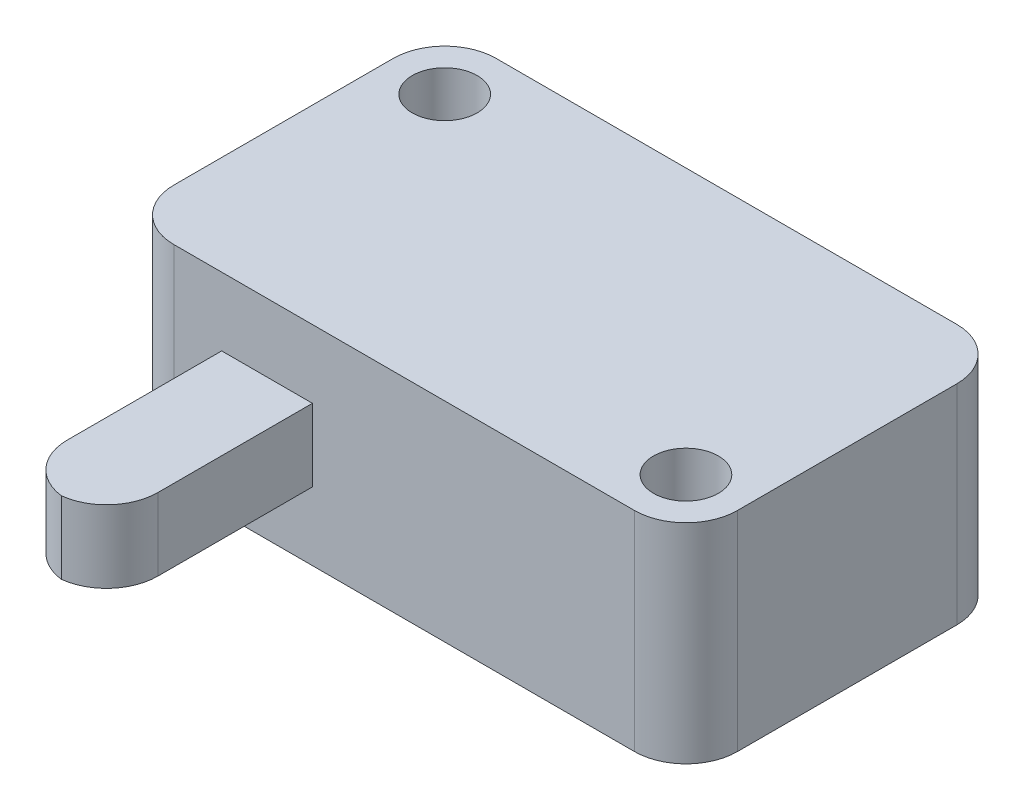
ISO-10303-21;
HEADER;
FILE_DESCRIPTION(('STEP AP214'),'2;1');
FILE_NAME('part.step','',(''),(''),'','','');
FILE_SCHEMA(('AUTOMOTIVE_DESIGN { 1 0 10303 214 1 1 1 1 }'));
ENDSEC;
DATA;
#1=APPLICATION_CONTEXT('core data for automotive mechanical design processes');
#2=APPLICATION_PROTOCOL_DEFINITION('international standard','automotive_design',2000,#1);
#3=PRODUCT_CONTEXT('',#1,'mechanical');
#4=PRODUCT('Part','Part','',(#3));
#5=PRODUCT_RELATED_PRODUCT_CATEGORY('part','',(#4));
#6=PRODUCT_DEFINITION_FORMATION('','',#4);
#7=PRODUCT_DEFINITION_CONTEXT('part definition',#1,'design');
#8=PRODUCT_DEFINITION('design','',#6,#7);
#9=PRODUCT_DEFINITION_SHAPE('','',#8);
#10=(LENGTH_UNIT() NAMED_UNIT(*) SI_UNIT(.MILLI.,.METRE.));
#11=(NAMED_UNIT(*) PLANE_ANGLE_UNIT() SI_UNIT($,.RADIAN.));
#12=(NAMED_UNIT(*) SI_UNIT($,.STERADIAN.) SOLID_ANGLE_UNIT());
#13=UNCERTAINTY_MEASURE_WITH_UNIT(LENGTH_MEASURE(1.E-05),#10,'distance_accuracy_value','');
#14=(GEOMETRIC_REPRESENTATION_CONTEXT(3) GLOBAL_UNCERTAINTY_ASSIGNED_CONTEXT((#13)) GLOBAL_UNIT_ASSIGNED_CONTEXT((#10,
#11,#12)) REPRESENTATION_CONTEXT('',''));
#15=CARTESIAN_POINT('',(0.,0.,0.));
#16=DIRECTION('',(0.,0.,1.));
#17=DIRECTION('',(1.,0.,0.));
#18=AXIS2_PLACEMENT_3D('',#15,#16,#17);
#19=CARTESIAN_POINT('',(-13.9,10.3,7.95));
#20=DIRECTION('',(0.,0.,-1.));
#21=DIRECTION('',(-1.,0.,0.));
#22=AXIS2_PLACEMENT_3D('',#19,#20,#21);
#23=PLANE('',#22);
#24=DIRECTION('',(1.,0.,0.));
#25=VECTOR('',#24,1.);
#26=CARTESIAN_POINT('',(-13.9,10.3,7.95));
#27=LINE('',#26,#25);
#28=CARTESIAN_POINT('',(-11.36,10.3,7.95));
#29=VERTEX_POINT('',#28);
#30=CARTESIAN_POINT('',(11.36,10.3,7.95));
#31=VERTEX_POINT('',#30);
#32=EDGE_CURVE('E181',#29,#31,#27,.T.);
#33=ORIENTED_EDGE('',*,*,#32,.F.);
#34=DIRECTION('',(0.,-1.,0.));
#35=VECTOR('',#34,1.);
#36=CARTESIAN_POINT('',(-11.36,10.3,7.95));
#37=LINE('',#36,#35);
#38=CARTESIAN_POINT('',(-11.36,0.,7.95));
#39=VERTEX_POINT('',#38);
#40=EDGE_CURVE('E196',#29,#39,#37,.T.);
#41=ORIENTED_EDGE('',*,*,#40,.T.);
#42=DIRECTION('',(1.,0.,0.));
#43=VECTOR('',#42,1.);
#44=CARTESIAN_POINT('',(-13.9,0.,7.95));
#45=LINE('',#44,#43);
#46=CARTESIAN_POINT('',(11.36,0.,7.95));
#47=VERTEX_POINT('',#46);
#48=EDGE_CURVE('E175',#39,#47,#45,.T.);
#49=ORIENTED_EDGE('',*,*,#48,.T.);
#50=DIRECTION('',(0.,-1.,0.));
#51=VECTOR('',#50,1.);
#52=CARTESIAN_POINT('',(11.36,10.3,7.95));
#53=LINE('',#52,#51);
#54=EDGE_CURVE('E184',#47,#31,#53,.F.);
#55=ORIENTED_EDGE('',*,*,#54,.T.);
#56=EDGE_LOOP('',(#33,#41,#49,#55));
#57=FACE_BOUND('',#56,.T.);
#58=DIRECTION('',(1.,0.,0.));
#59=VECTOR('',#58,1.);
#60=CARTESIAN_POINT('',(-4.52382319195976,3.3643919059321,7.95));
#61=LINE('',#60,#59);
#62=CARTESIAN_POINT('',(-9.,3.3643919059321,7.95));
#63=VERTEX_POINT('',#62);
#64=CARTESIAN_POINT('',(-4.52382319195976,3.3643919059321,7.95));
#65=VERTEX_POINT('',#64);
#66=EDGE_CURVE('E129',#63,#65,#61,.T.);
#67=ORIENTED_EDGE('',*,*,#66,.F.);
#68=DIRECTION('',(0.,-1.,0.));
#69=VECTOR('',#68,1.);
#70=CARTESIAN_POINT('',(-9.,5.15,7.95));
#71=LINE('',#70,#69);
#72=CARTESIAN_POINT('',(-9.,6.9356080940679,7.95));
#73=VERTEX_POINT('',#72);
#74=EDGE_CURVE('E143',#73,#63,#71,.T.);
#75=ORIENTED_EDGE('',*,*,#74,.F.);
#76=DIRECTION('',(-1.,0.,0.));
#77=VECTOR('',#76,1.);
#78=CARTESIAN_POINT('',(-9.,6.9356080940679,7.95));
#79=LINE('',#78,#77);
#80=CARTESIAN_POINT('',(-4.52382319195976,6.9356080940679,7.95));
#81=VERTEX_POINT('',#80);
#82=EDGE_CURVE('E150',#81,#73,#79,.T.);
#83=ORIENTED_EDGE('',*,*,#82,.F.);
#84=DIRECTION('',(0.,1.,0.));
#85=VECTOR('',#84,1.);
#86=CARTESIAN_POINT('',(-4.52382319195976,6.9356080940679,7.95));
#87=LINE('',#86,#85);
#88=EDGE_CURVE('E146',#65,#81,#87,.T.);
#89=ORIENTED_EDGE('',*,*,#88,.F.);
#90=EDGE_LOOP('',(#67,#75,#83,#89));
#91=FACE_BOUND('',#90,.T.);
#92=ADVANCED_FACE('F33',(#57,#91),#23,.F.);
#93=CARTESIAN_POINT('',(13.9,10.3,7.95));
#94=DIRECTION('',(-1.,0.,0.));
#95=DIRECTION('',(0.,0.,1.));
#96=AXIS2_PLACEMENT_3D('',#93,#94,#95);
#97=PLANE('',#96);
#98=DIRECTION('',(0.,0.,-1.));
#99=VECTOR('',#98,1.);
#100=CARTESIAN_POINT('',(13.9,0.,7.95));
#101=LINE('',#100,#99);
#102=CARTESIAN_POINT('',(13.9,0.,5.41));
#103=VERTEX_POINT('',#102);
#104=CARTESIAN_POINT('',(13.9,0.,-5.41));
#105=VERTEX_POINT('',#104);
#106=EDGE_CURVE('E168',#103,#105,#101,.T.);
#107=ORIENTED_EDGE('',*,*,#106,.T.);
#108=DIRECTION('',(0.,-1.,0.));
#109=VECTOR('',#108,1.);
#110=CARTESIAN_POINT('',(13.9,10.3,-5.41));
#111=LINE('',#110,#109);
#112=CARTESIAN_POINT('',(13.9,10.3,-5.41));
#113=VERTEX_POINT('',#112);
#114=EDGE_CURVE('E228',#105,#113,#111,.F.);
#115=ORIENTED_EDGE('',*,*,#114,.T.);
#116=DIRECTION('',(0.,0.,-1.));
#117=VECTOR('',#116,1.);
#118=CARTESIAN_POINT('',(13.9,10.3,7.95));
#119=LINE('',#118,#117);
#120=CARTESIAN_POINT('',(13.9,10.3,5.41));
#121=VERTEX_POINT('',#120);
#122=EDGE_CURVE('E171',#121,#113,#119,.T.);
#123=ORIENTED_EDGE('',*,*,#122,.F.);
#124=DIRECTION('',(0.,-1.,0.));
#125=VECTOR('',#124,1.);
#126=CARTESIAN_POINT('',(13.9,10.3,5.41));
#127=LINE('',#126,#125);
#128=EDGE_CURVE('E225',#121,#103,#127,.T.);
#129=ORIENTED_EDGE('',*,*,#128,.T.);
#130=EDGE_LOOP('',(#107,#115,#123,#129));
#131=FACE_BOUND('',#130,.T.);
#132=ADVANCED_FACE('F253',(#131),#97,.F.);
#133=CARTESIAN_POINT('',(-13.9,10.3,-7.95));
#134=DIRECTION('',(0.,0.,1.));
#135=DIRECTION('',(1.,0.,0.));
#136=AXIS2_PLACEMENT_3D('',#133,#134,#135);
#137=PLANE('',#136);
#138=DIRECTION('',(-1.,0.,0.));
#139=VECTOR('',#138,1.);
#140=CARTESIAN_POINT('',(-13.9,0.,-7.95));
#141=LINE('',#140,#139);
#142=CARTESIAN_POINT('',(11.36,0.,-7.95));
#143=VERTEX_POINT('',#142);
#144=CARTESIAN_POINT('',(-11.36,0.,-7.95));
#145=VERTEX_POINT('',#144);
#146=EDGE_CURVE('E187',#143,#145,#141,.T.);
#147=ORIENTED_EDGE('',*,*,#146,.T.);
#148=DIRECTION('',(0.,-1.,0.));
#149=VECTOR('',#148,1.);
#150=CARTESIAN_POINT('',(-11.36,10.3,-7.95));
#151=LINE('',#150,#149);
#152=CARTESIAN_POINT('',(-11.36,10.3,-7.95));
#153=VERTEX_POINT('',#152);
#154=EDGE_CURVE('E223',#145,#153,#151,.F.);
#155=ORIENTED_EDGE('',*,*,#154,.T.);
#156=DIRECTION('',(-1.,0.,0.));
#157=VECTOR('',#156,1.);
#158=CARTESIAN_POINT('',(-13.9,10.3,-7.95));
#159=LINE('',#158,#157);
#160=CARTESIAN_POINT('',(11.36,10.3,-7.95));
#161=VERTEX_POINT('',#160);
#162=EDGE_CURVE('E174',#161,#153,#159,.T.);
#163=ORIENTED_EDGE('',*,*,#162,.F.);
#164=DIRECTION('',(0.,-1.,0.));
#165=VECTOR('',#164,1.);
#166=CARTESIAN_POINT('',(11.36,10.3,-7.95));
#167=LINE('',#166,#165);
#168=EDGE_CURVE('E220',#161,#143,#167,.T.);
#169=ORIENTED_EDGE('',*,*,#168,.T.);
#170=EDGE_LOOP('',(#147,#155,#163,#169));
#171=FACE_BOUND('',#170,.T.);
#172=ADVANCED_FACE('F259',(#171),#137,.F.);
#173=CARTESIAN_POINT('',(-13.9,10.3,7.95));
#174=DIRECTION('',(1.,0.,0.));
#175=DIRECTION('',(0.,0.,-1.));
#176=AXIS2_PLACEMENT_3D('',#173,#174,#175);
#177=PLANE('',#176);
#178=DIRECTION('',(0.,0.,1.));
#179=VECTOR('',#178,1.);
#180=CARTESIAN_POINT('',(-13.9,0.,7.95));
#181=LINE('',#180,#179);
#182=CARTESIAN_POINT('',(-13.9,0.,-5.41));
#183=VERTEX_POINT('',#182);
#184=CARTESIAN_POINT('',(-13.9,0.,5.41));
#185=VERTEX_POINT('',#184);
#186=EDGE_CURVE('E190',#183,#185,#181,.T.);
#187=ORIENTED_EDGE('',*,*,#186,.T.);
#188=DIRECTION('',(0.,-1.,0.));
#189=VECTOR('',#188,1.);
#190=CARTESIAN_POINT('',(-13.9,10.3,5.41));
#191=LINE('',#190,#189);
#192=CARTESIAN_POINT('',(-13.9,10.3,5.41));
#193=VERTEX_POINT('',#192);
#194=EDGE_CURVE('E210',#185,#193,#191,.F.);
#195=ORIENTED_EDGE('',*,*,#194,.T.);
#196=DIRECTION('',(0.,0.,1.));
#197=VECTOR('',#196,1.);
#198=CARTESIAN_POINT('',(-13.9,10.3,7.95));
#199=LINE('',#198,#197);
#200=CARTESIAN_POINT('',(-13.9,10.3,-5.41));
#201=VERTEX_POINT('',#200);
#202=EDGE_CURVE('E178',#201,#193,#199,.T.);
#203=ORIENTED_EDGE('',*,*,#202,.F.);
#204=DIRECTION('',(0.,-1.,0.));
#205=VECTOR('',#204,1.);
#206=CARTESIAN_POINT('',(-13.9,10.3,-5.41));
#207=LINE('',#206,#205);
#208=EDGE_CURVE('E207',#201,#183,#207,.T.);
#209=ORIENTED_EDGE('',*,*,#208,.T.);
#210=EDGE_LOOP('',(#187,#195,#203,#209));
#211=FACE_BOUND('',#210,.T.);
#212=ADVANCED_FACE('F267',(#211),#177,.F.);
#213=CARTESIAN_POINT('',(0.,10.3,0.));
#214=DIRECTION('',(0.,-1.,0.));
#215=DIRECTION('',(0.,0.,-1.));
#216=AXIS2_PLACEMENT_3D('',#213,#214,#215);
#217=PLANE('',#216);
#218=CARTESIAN_POINT('',(11.1,10.3,5.15));
#219=DIRECTION('',(0.,1.,0.));
#220=DIRECTION('',(0.,0.,-1.));
#221=AXIS2_PLACEMENT_3D('',#218,#219,#220);
#222=CIRCLE('',#221,1.6);
#223=CARTESIAN_POINT('',(11.1,10.3,6.75));
#224=VERTEX_POINT('',#223);
#225=EDGE_CURVE('E136',#224,#224,#222,.T.);
#226=ORIENTED_EDGE('',*,*,#225,.F.);
#227=EDGE_LOOP('',(#226));
#228=FACE_BOUND('',#227,.T.);
#229=CARTESIAN_POINT('',(-11.1,10.3,-5.15));
#230=DIRECTION('',(0.,1.,0.));
#231=DIRECTION('',(0.,0.,1.));
#232=AXIS2_PLACEMENT_3D('',#229,#230,#231);
#233=CIRCLE('',#232,1.6);
#234=CARTESIAN_POINT('',(-11.1,10.3,-3.55));
#235=VERTEX_POINT('',#234);
#236=EDGE_CURVE('E162',#235,#235,#233,.T.);
#237=ORIENTED_EDGE('',*,*,#236,.F.);
#238=EDGE_LOOP('',(#237));
#239=FACE_BOUND('',#238,.T.);
#240=ORIENTED_EDGE('',*,*,#202,.T.);
#241=CARTESIAN_POINT('',(-11.36,10.3,5.41));
#242=DIRECTION('',(0.,-1.,0.));
#243=DIRECTION('',(0.,0.,-1.));
#244=AXIS2_PLACEMENT_3D('',#241,#242,#243);
#245=CIRCLE('',#244,2.54);
#246=EDGE_CURVE('E218',#193,#29,#245,.F.);
#247=ORIENTED_EDGE('',*,*,#246,.T.);
#248=ORIENTED_EDGE('',*,*,#32,.T.);
#249=CARTESIAN_POINT('',(11.36,10.3,5.41));
#250=DIRECTION('',(0.,-1.,0.));
#251=DIRECTION('',(0.,0.,-1.));
#252=AXIS2_PLACEMENT_3D('',#249,#250,#251);
#253=CIRCLE('',#252,2.54);
#254=EDGE_CURVE('E212',#31,#121,#253,.F.);
#255=ORIENTED_EDGE('',*,*,#254,.T.);
#256=ORIENTED_EDGE('',*,*,#122,.T.);
#257=CARTESIAN_POINT('',(11.36,10.3,-5.41));
#258=DIRECTION('',(0.,-1.,0.));
#259=DIRECTION('',(0.,0.,-1.));
#260=AXIS2_PLACEMENT_3D('',#257,#258,#259);
#261=CIRCLE('',#260,2.54);
#262=EDGE_CURVE('E214',#113,#161,#261,.F.);
#263=ORIENTED_EDGE('',*,*,#262,.T.);
#264=ORIENTED_EDGE('',*,*,#162,.T.);
#265=CARTESIAN_POINT('',(-11.36,10.3,-5.41));
#266=DIRECTION('',(0.,-1.,0.));
#267=DIRECTION('',(0.,0.,-1.));
#268=AXIS2_PLACEMENT_3D('',#265,#266,#267);
#269=CIRCLE('',#268,2.54);
#270=EDGE_CURVE('E216',#153,#201,#269,.F.);
#271=ORIENTED_EDGE('',*,*,#270,.T.);
#272=EDGE_LOOP('',(#240,#247,#248,#255,#256,#263,#264,#271));
#273=FACE_BOUND('',#272,.T.);
#274=ADVANCED_FACE('F270',(#228,#239,#273),#217,.F.);
#275=CARTESIAN_POINT('',(0.,0.,0.));
#276=DIRECTION('',(0.,-1.,0.));
#277=DIRECTION('',(0.,0.,-1.));
#278=AXIS2_PLACEMENT_3D('',#275,#276,#277);
#279=PLANE('',#278);
#280=CARTESIAN_POINT('',(11.1,0.,5.15));
#281=DIRECTION('',(0.,1.,0.));
#282=DIRECTION('',(0.,0.,-1.));
#283=AXIS2_PLACEMENT_3D('',#280,#281,#282);
#284=CIRCLE('',#283,1.6);
#285=CARTESIAN_POINT('',(11.1,0.,6.75));
#286=VERTEX_POINT('',#285);
#287=EDGE_CURVE('E159',#286,#286,#284,.T.);
#288=ORIENTED_EDGE('',*,*,#287,.T.);
#289=EDGE_LOOP('',(#288));
#290=FACE_BOUND('',#289,.T.);
#291=CARTESIAN_POINT('',(-11.1,0.,-5.15));
#292=DIRECTION('',(0.,1.,0.));
#293=DIRECTION('',(0.,0.,1.));
#294=AXIS2_PLACEMENT_3D('',#291,#292,#293);
#295=CIRCLE('',#294,1.6);
#296=CARTESIAN_POINT('',(-11.1,0.,-3.55));
#297=VERTEX_POINT('',#296);
#298=EDGE_CURVE('E165',#297,#297,#295,.T.);
#299=ORIENTED_EDGE('',*,*,#298,.T.);
#300=EDGE_LOOP('',(#299));
#301=FACE_BOUND('',#300,.T.);
#302=ORIENTED_EDGE('',*,*,#48,.F.);
#303=CARTESIAN_POINT('',(-11.36,0.,5.41));
#304=DIRECTION('',(0.,-1.,0.));
#305=DIRECTION('',(0.,0.,-1.));
#306=AXIS2_PLACEMENT_3D('',#303,#304,#305);
#307=CIRCLE('',#306,2.54);
#308=EDGE_CURVE('E205',#39,#185,#307,.T.);
#309=ORIENTED_EDGE('',*,*,#308,.T.);
#310=ORIENTED_EDGE('',*,*,#186,.F.);
#311=CARTESIAN_POINT('',(-11.36,0.,-5.41));
#312=DIRECTION('',(0.,-1.,0.));
#313=DIRECTION('',(0.,0.,-1.));
#314=AXIS2_PLACEMENT_3D('',#311,#312,#313);
#315=CIRCLE('',#314,2.54);
#316=EDGE_CURVE('E203',#183,#145,#315,.T.);
#317=ORIENTED_EDGE('',*,*,#316,.T.);
#318=ORIENTED_EDGE('',*,*,#146,.F.);
#319=CARTESIAN_POINT('',(11.36,0.,-5.41));
#320=DIRECTION('',(0.,-1.,0.));
#321=DIRECTION('',(0.,0.,-1.));
#322=AXIS2_PLACEMENT_3D('',#319,#320,#321);
#323=CIRCLE('',#322,2.54);
#324=EDGE_CURVE('E201',#143,#105,#323,.T.);
#325=ORIENTED_EDGE('',*,*,#324,.T.);
#326=ORIENTED_EDGE('',*,*,#106,.F.);
#327=CARTESIAN_POINT('',(11.36,0.,5.41));
#328=DIRECTION('',(0.,-1.,0.));
#329=DIRECTION('',(0.,0.,-1.));
#330=AXIS2_PLACEMENT_3D('',#327,#328,#329);
#331=CIRCLE('',#330,2.54);
#332=EDGE_CURVE('E199',#103,#47,#331,.T.);
#333=ORIENTED_EDGE('',*,*,#332,.T.);
#334=EDGE_LOOP('',(#302,#309,#310,#317,#318,#325,#326,#333));
#335=FACE_BOUND('',#334,.T.);
#336=ADVANCED_FACE('F265',(#290,#301,#335),#279,.T.);
#337=CARTESIAN_POINT('',(-11.1,0.,-5.15));
#338=DIRECTION('',(0.,1.,0.));
#339=DIRECTION('',(0.,0.,1.));
#340=AXIS2_PLACEMENT_3D('',#337,#338,#339);
#341=CYLINDRICAL_SURFACE('',#340,1.6);
#342=CARTESIAN_POINT('',(-11.1,0.,-3.55));
#343=CARTESIAN_POINT('',(-11.1,0.107291666666667,-3.55));
#344=CARTESIAN_POINT('',(-11.1,0.214583333333333,-3.55));
#345=CARTESIAN_POINT('',(-11.1,0.429166666666667,-3.55));
#346=CARTESIAN_POINT('',(-11.1,0.536458333333333,-3.55));
#347=CARTESIAN_POINT('',(-11.1,0.751041666666667,-3.55));
#348=CARTESIAN_POINT('',(-11.1,0.858333333333333,-3.55));
#349=CARTESIAN_POINT('',(-11.1,1.07291666666667,-3.55));
#350=CARTESIAN_POINT('',(-11.1,1.18020833333333,-3.55));
#351=CARTESIAN_POINT('',(-11.1,1.39479166666667,-3.55));
#352=CARTESIAN_POINT('',(-11.1,1.50208333333333,-3.55));
#353=CARTESIAN_POINT('',(-11.1,1.71666666666667,-3.55));
#354=CARTESIAN_POINT('',(-11.1,1.82395833333333,-3.55));
#355=CARTESIAN_POINT('',(-11.1,2.03854166666667,-3.55));
#356=CARTESIAN_POINT('',(-11.1,2.14583333333333,-3.55));
#357=CARTESIAN_POINT('',(-11.1,2.36041666666667,-3.55));
#358=CARTESIAN_POINT('',(-11.1,2.46770833333333,-3.55));
#359=CARTESIAN_POINT('',(-11.1,2.68229166666667,-3.55));
#360=CARTESIAN_POINT('',(-11.1,2.78958333333333,-3.55));
#361=CARTESIAN_POINT('',(-11.1,3.00416666666667,-3.55));
#362=CARTESIAN_POINT('',(-11.1,3.11145833333333,-3.55));
#363=CARTESIAN_POINT('',(-11.1,3.32604166666667,-3.55));
#364=CARTESIAN_POINT('',(-11.1,3.43333333333333,-3.55));
#365=CARTESIAN_POINT('',(-11.1,3.64791666666667,-3.55));
#366=CARTESIAN_POINT('',(-11.1,3.75520833333333,-3.55));
#367=CARTESIAN_POINT('',(-11.1,3.96979166666667,-3.55));
#368=CARTESIAN_POINT('',(-11.1,4.07708333333333,-3.55));
#369=CARTESIAN_POINT('',(-11.1,4.29166666666667,-3.55));
#370=CARTESIAN_POINT('',(-11.1,4.39895833333333,-3.55));
#371=CARTESIAN_POINT('',(-11.1,4.61354166666667,-3.55));
#372=CARTESIAN_POINT('',(-11.1,4.72083333333333,-3.55));
#373=CARTESIAN_POINT('',(-11.1,4.93541666666667,-3.55));
#374=CARTESIAN_POINT('',(-11.1,5.04270833333333,-3.55));
#375=CARTESIAN_POINT('',(-11.1,5.25729166666667,-3.55));
#376=CARTESIAN_POINT('',(-11.1,5.36458333333333,-3.55));
#377=CARTESIAN_POINT('',(-11.1,5.57916666666667,-3.55));
#378=CARTESIAN_POINT('',(-11.1,5.68645833333333,-3.55));
#379=CARTESIAN_POINT('',(-11.1,5.90104166666667,-3.55));
#380=CARTESIAN_POINT('',(-11.1,6.00833333333333,-3.55));
#381=CARTESIAN_POINT('',(-11.1,6.22291666666667,-3.55));
#382=CARTESIAN_POINT('',(-11.1,6.33020833333333,-3.55));
#383=CARTESIAN_POINT('',(-11.1,6.54479166666667,-3.55));
#384=CARTESIAN_POINT('',(-11.1,6.65208333333333,-3.55));
#385=CARTESIAN_POINT('',(-11.1,6.86666666666667,-3.55));
#386=CARTESIAN_POINT('',(-11.1,6.97395833333333,-3.55));
#387=CARTESIAN_POINT('',(-11.1,7.18854166666667,-3.55));
#388=CARTESIAN_POINT('',(-11.1,7.29583333333333,-3.55));
#389=CARTESIAN_POINT('',(-11.1,7.51041666666667,-3.55));
#390=CARTESIAN_POINT('',(-11.1,7.61770833333333,-3.55));
#391=CARTESIAN_POINT('',(-11.1,7.83229166666667,-3.55));
#392=CARTESIAN_POINT('',(-11.1,7.93958333333333,-3.55));
#393=CARTESIAN_POINT('',(-11.1,8.15416666666667,-3.55));
#394=CARTESIAN_POINT('',(-11.1,8.26145833333333,-3.55));
#395=CARTESIAN_POINT('',(-11.1,8.47604166666667,-3.55));
#396=CARTESIAN_POINT('',(-11.1,8.58333333333333,-3.55));
#397=CARTESIAN_POINT('',(-11.1,8.79791666666667,-3.55));
#398=CARTESIAN_POINT('',(-11.1,8.90520833333333,-3.55));
#399=CARTESIAN_POINT('',(-11.1,9.11979166666666,-3.55));
#400=CARTESIAN_POINT('',(-11.1,9.22708333333333,-3.55));
#401=CARTESIAN_POINT('',(-11.1,9.44166666666667,-3.55));
#402=CARTESIAN_POINT('',(-11.1,9.54895833333333,-3.55));
#403=CARTESIAN_POINT('',(-11.1,9.76354166666667,-3.55));
#404=CARTESIAN_POINT('',(-11.1,9.87083333333333,-3.55));
#405=CARTESIAN_POINT('',(-11.1,10.0854166666667,-3.55));
#406=CARTESIAN_POINT('',(-11.1,10.1927083333333,-3.55));
#407=CARTESIAN_POINT('',(-11.1,10.3,-3.55));
#408=B_SPLINE_CURVE_WITH_KNOTS('',3,(#342,#343,#344,#345,#346,#347,#348,#349,#350,#351,#352,
#353,#354,#355,#356,#357,#358,#359,#360,#361,#362,#363,#364,#365,#366,#367,#368,#369,#370,#371,
#372,#373,#374,#375,#376,#377,#378,#379,#380,#381,#382,#383,#384,#385,#386,#387,#388,#389,#390,
#391,#392,#393,#394,#395,#396,#397,#398,#399,#400,#401,#402,#403,#404,#405,#406,#407),
.UNSPECIFIED.,.F.,.F.,(4,2,2,2,2,2,2,2,2,2,2,2,2,2,2,2,2,2,2,2,2,2,2,2,2,2,2,2,2,2,2,2,4),(0.,
0.321875,0.64375,0.965625,1.2875,1.609375,1.93125,2.253125,2.575,2.896875,3.21875,3.540625,
3.8625,4.184375,4.50625,4.828125,5.15,5.471875,5.79375,6.115625,6.4375,6.759375,7.08125,
7.403125,7.725,8.046875,8.36875,8.690625,9.0125,9.334375,9.65625,9.978125,10.3),.UNSPECIFIED.);
#409=EDGE_CURVE('BSEAM312',#297,#235,#408,.T.);
#410=ORIENTED_EDGE('',*,*,#298,.F.);
#411=ORIENTED_EDGE('',*,*,#236,.T.);
#412=ORIENTED_EDGE('',*,*,#409,.T.);
#413=ORIENTED_EDGE('',*,*,#409,.F.);
#414=EDGE_LOOP('',(#410,#412,#411,#413));
#415=FACE_BOUND('',#414,.T.);
#416=ADVANCED_FACE('F312',(#415),#341,.F.);
#417=CARTESIAN_POINT('',(11.1,0.,5.15));
#418=DIRECTION('',(0.,1.,0.));
#419=DIRECTION('',(0.,0.,1.));
#420=AXIS2_PLACEMENT_3D('',#417,#418,#419);
#421=CYLINDRICAL_SURFACE('',#420,1.6);
#422=CARTESIAN_POINT('',(11.1,0.,6.75));
#423=CARTESIAN_POINT('',(11.1,0.107291666666667,6.75));
#424=CARTESIAN_POINT('',(11.1,0.214583333333333,6.75));
#425=CARTESIAN_POINT('',(11.1,0.429166666666667,6.75));
#426=CARTESIAN_POINT('',(11.1,0.536458333333333,6.75));
#427=CARTESIAN_POINT('',(11.1,0.751041666666667,6.75));
#428=CARTESIAN_POINT('',(11.1,0.858333333333333,6.75));
#429=CARTESIAN_POINT('',(11.1,1.07291666666667,6.75));
#430=CARTESIAN_POINT('',(11.1,1.18020833333333,6.75));
#431=CARTESIAN_POINT('',(11.1,1.39479166666667,6.75));
#432=CARTESIAN_POINT('',(11.1,1.50208333333333,6.75));
#433=CARTESIAN_POINT('',(11.1,1.71666666666667,6.75));
#434=CARTESIAN_POINT('',(11.1,1.82395833333333,6.75));
#435=CARTESIAN_POINT('',(11.1,2.03854166666667,6.75));
#436=CARTESIAN_POINT('',(11.1,2.14583333333333,6.75));
#437=CARTESIAN_POINT('',(11.1,2.36041666666667,6.75));
#438=CARTESIAN_POINT('',(11.1,2.46770833333333,6.75));
#439=CARTESIAN_POINT('',(11.1,2.68229166666667,6.75));
#440=CARTESIAN_POINT('',(11.1,2.78958333333333,6.75));
#441=CARTESIAN_POINT('',(11.1,3.00416666666667,6.75));
#442=CARTESIAN_POINT('',(11.1,3.11145833333333,6.75));
#443=CARTESIAN_POINT('',(11.1,3.32604166666667,6.75));
#444=CARTESIAN_POINT('',(11.1,3.43333333333333,6.75));
#445=CARTESIAN_POINT('',(11.1,3.64791666666667,6.75));
#446=CARTESIAN_POINT('',(11.1,3.75520833333333,6.75));
#447=CARTESIAN_POINT('',(11.1,3.96979166666667,6.75));
#448=CARTESIAN_POINT('',(11.1,4.07708333333333,6.75));
#449=CARTESIAN_POINT('',(11.1,4.29166666666667,6.75));
#450=CARTESIAN_POINT('',(11.1,4.39895833333333,6.75));
#451=CARTESIAN_POINT('',(11.1,4.61354166666667,6.75));
#452=CARTESIAN_POINT('',(11.1,4.72083333333333,6.75));
#453=CARTESIAN_POINT('',(11.1,4.93541666666667,6.75));
#454=CARTESIAN_POINT('',(11.1,5.04270833333333,6.75));
#455=CARTESIAN_POINT('',(11.1,5.25729166666667,6.75));
#456=CARTESIAN_POINT('',(11.1,5.36458333333333,6.75));
#457=CARTESIAN_POINT('',(11.1,5.57916666666667,6.75));
#458=CARTESIAN_POINT('',(11.1,5.68645833333333,6.75));
#459=CARTESIAN_POINT('',(11.1,5.90104166666667,6.75));
#460=CARTESIAN_POINT('',(11.1,6.00833333333333,6.75));
#461=CARTESIAN_POINT('',(11.1,6.22291666666667,6.75));
#462=CARTESIAN_POINT('',(11.1,6.33020833333333,6.75));
#463=CARTESIAN_POINT('',(11.1,6.54479166666667,6.75));
#464=CARTESIAN_POINT('',(11.1,6.65208333333333,6.75));
#465=CARTESIAN_POINT('',(11.1,6.86666666666667,6.75));
#466=CARTESIAN_POINT('',(11.1,6.97395833333333,6.75));
#467=CARTESIAN_POINT('',(11.1,7.18854166666667,6.75));
#468=CARTESIAN_POINT('',(11.1,7.29583333333333,6.75));
#469=CARTESIAN_POINT('',(11.1,7.51041666666667,6.75));
#470=CARTESIAN_POINT('',(11.1,7.61770833333333,6.75));
#471=CARTESIAN_POINT('',(11.1,7.83229166666667,6.75));
#472=CARTESIAN_POINT('',(11.1,7.93958333333333,6.75));
#473=CARTESIAN_POINT('',(11.1,8.15416666666667,6.75));
#474=CARTESIAN_POINT('',(11.1,8.26145833333333,6.75));
#475=CARTESIAN_POINT('',(11.1,8.47604166666667,6.75));
#476=CARTESIAN_POINT('',(11.1,8.58333333333333,6.75));
#477=CARTESIAN_POINT('',(11.1,8.79791666666667,6.75));
#478=CARTESIAN_POINT('',(11.1,8.90520833333333,6.75));
#479=CARTESIAN_POINT('',(11.1,9.11979166666666,6.75));
#480=CARTESIAN_POINT('',(11.1,9.22708333333333,6.75));
#481=CARTESIAN_POINT('',(11.1,9.44166666666667,6.75));
#482=CARTESIAN_POINT('',(11.1,9.54895833333333,6.75));
#483=CARTESIAN_POINT('',(11.1,9.76354166666667,6.75));
#484=CARTESIAN_POINT('',(11.1,9.87083333333333,6.75));
#485=CARTESIAN_POINT('',(11.1,10.0854166666667,6.75));
#486=CARTESIAN_POINT('',(11.1,10.1927083333333,6.75));
#487=CARTESIAN_POINT('',(11.1,10.3,6.75));
#488=B_SPLINE_CURVE_WITH_KNOTS('',3,(#422,#423,#424,#425,#426,#427,#428,#429,#430,#431,#432,
#433,#434,#435,#436,#437,#438,#439,#440,#441,#442,#443,#444,#445,#446,#447,#448,#449,#450,#451,
#452,#453,#454,#455,#456,#457,#458,#459,#460,#461,#462,#463,#464,#465,#466,#467,#468,#469,#470,
#471,#472,#473,#474,#475,#476,#477,#478,#479,#480,#481,#482,#483,#484,#485,#486,#487),
.UNSPECIFIED.,.F.,.F.,(4,2,2,2,2,2,2,2,2,2,2,2,2,2,2,2,2,2,2,2,2,2,2,2,2,2,2,2,2,2,2,2,4),(0.,
0.321875,0.64375,0.965625,1.2875,1.609375,1.93125,2.253125,2.575,2.896875,3.21875,3.540625,
3.8625,4.184375,4.50625,4.828125,5.15,5.471875,5.79375,6.115625,6.4375,6.759375,7.08125,
7.403125,7.725,8.046875,8.36875,8.690625,9.0125,9.334375,9.65625,9.978125,10.3),.UNSPECIFIED.);
#489=EDGE_CURVE('BSEAM318',#286,#224,#488,.T.);
#490=ORIENTED_EDGE('',*,*,#287,.F.);
#491=ORIENTED_EDGE('',*,*,#225,.T.);
#492=ORIENTED_EDGE('',*,*,#489,.T.);
#493=ORIENTED_EDGE('',*,*,#489,.F.);
#494=EDGE_LOOP('',(#490,#492,#491,#493));
#495=FACE_BOUND('',#494,.T.);
#496=ADVANCED_FACE('F318',(#495),#421,.F.);
#497=CARTESIAN_POINT('',(-4.52382319195976,3.3643919059321,18.11));
#498=DIRECTION('',(0.,1.,0.));
#499=DIRECTION('',(-1.,0.,0.));
#500=AXIS2_PLACEMENT_3D('',#497,#498,#499);
#501=PLANE('',#500);
#502=CARTESIAN_POINT('',(-7.06382319195976,3.3643919059321,15.57));
#503=DIRECTION('',(0.,1.,0.));
#504=DIRECTION('',(-1.,0.,0.));
#505=AXIS2_PLACEMENT_3D('',#502,#503,#504);
#506=CIRCLE('',#505,2.54);
#507=CARTESIAN_POINT('',(-4.52382319195976,3.3643919059321,15.57));
#508=VERTEX_POINT('',#507);
#509=CARTESIAN_POINT('',(-6.76191159597988,3.3643919059321,18.0919931380186));
#510=VERTEX_POINT('',#509);
#511=EDGE_CURVE('E230',#508,#510,#506,.F.);
#512=ORIENTED_EDGE('',*,*,#511,.T.);
#513=CARTESIAN_POINT('',(-6.46,3.3643919059321,15.57));
#514=DIRECTION('',(0.,1.,0.));
#515=DIRECTION('',(-1.,0.,0.));
#516=AXIS2_PLACEMENT_3D('',#513,#514,#515);
#517=CIRCLE('',#516,2.54);
#518=CARTESIAN_POINT('',(-9.,3.3643919059321,15.57));
#519=VERTEX_POINT('',#518);
#520=EDGE_CURVE('E131',#510,#519,#517,.F.);
#521=ORIENTED_EDGE('',*,*,#520,.T.);
#522=DIRECTION('',(0.,0.,-1.));
#523=VECTOR('',#522,1.);
#524=CARTESIAN_POINT('',(-9.,3.3643919059321,18.11));
#525=LINE('',#524,#523);
#526=EDGE_CURVE('E125',#519,#63,#525,.T.);
#527=ORIENTED_EDGE('',*,*,#526,.T.);
#528=ORIENTED_EDGE('',*,*,#66,.T.);
#529=DIRECTION('',(0.,0.,-1.));
#530=VECTOR('',#529,1.);
#531=CARTESIAN_POINT('',(-4.52382319195976,3.3643919059321,18.11));
#532=LINE('',#531,#530);
#533=EDGE_CURVE('E137',#508,#65,#532,.T.);
#534=ORIENTED_EDGE('',*,*,#533,.F.);
#535=EDGE_LOOP('',(#512,#521,#527,#528,#534));
#536=FACE_BOUND('',#535,.T.);
#537=ADVANCED_FACE('F127',(#536),#501,.F.);
#538=CARTESIAN_POINT('',(-4.52382319195976,6.9356080940679,18.11));
#539=DIRECTION('',(-1.,0.,0.));
#540=DIRECTION('',(0.,0.,1.));
#541=AXIS2_PLACEMENT_3D('',#538,#539,#540);
#542=PLANE('',#541);
#543=DIRECTION('',(0.,0.,-1.));
#544=VECTOR('',#543,1.);
#545=CARTESIAN_POINT('',(-4.52382319195976,6.9356080940679,18.11));
#546=LINE('',#545,#544);
#547=CARTESIAN_POINT('',(-4.52382319195976,6.9356080940679,15.57));
#548=VERTEX_POINT('',#547);
#549=EDGE_CURVE('E152',#548,#81,#546,.T.);
#550=ORIENTED_EDGE('',*,*,#549,.F.);
#551=DIRECTION('',(0.,1.,0.));
#552=VECTOR('',#551,1.);
#553=CARTESIAN_POINT('',(-4.52382319195976,6.9356080940679,15.57));
#554=LINE('',#553,#552);
#555=EDGE_CURVE('E11',#548,#508,#554,.F.);
#556=ORIENTED_EDGE('',*,*,#555,.T.);
#557=ORIENTED_EDGE('',*,*,#533,.T.);
#558=ORIENTED_EDGE('',*,*,#88,.T.);
#559=EDGE_LOOP('',(#550,#556,#557,#558));
#560=FACE_BOUND('',#559,.T.);
#561=ADVANCED_FACE('F239',(#560),#542,.F.);
#562=CARTESIAN_POINT('',(-9.,6.9356080940679,18.11));
#563=DIRECTION('',(0.,-1.,0.));
#564=DIRECTION('',(0.,0.,-1.));
#565=AXIS2_PLACEMENT_3D('',#562,#563,#564);
#566=PLANE('',#565);
#567=DIRECTION('',(0.,0.,-1.));
#568=VECTOR('',#567,1.);
#569=CARTESIAN_POINT('',(-9.,6.9356080940679,18.11));
#570=LINE('',#569,#568);
#571=CARTESIAN_POINT('',(-9.,6.9356080940679,15.57));
#572=VERTEX_POINT('',#571);
#573=EDGE_CURVE('E149',#572,#73,#570,.T.);
#574=ORIENTED_EDGE('',*,*,#573,.F.);
#575=CARTESIAN_POINT('',(-6.46,6.9356080940679,15.57));
#576=DIRECTION('',(0.,-1.,0.));
#577=DIRECTION('',(0.,0.,-1.));
#578=AXIS2_PLACEMENT_3D('',#575,#576,#577);
#579=CIRCLE('',#578,2.54);
#580=CARTESIAN_POINT('',(-6.76191159597988,6.9356080940679,18.0919931380186));
#581=VERTEX_POINT('',#580);
#582=EDGE_CURVE('E42',#572,#581,#579,.F.);
#583=ORIENTED_EDGE('',*,*,#582,.T.);
#584=CARTESIAN_POINT('',(-7.06382319195976,6.9356080940679,15.57));
#585=DIRECTION('',(0.,-1.,0.));
#586=DIRECTION('',(0.,0.,-1.));
#587=AXIS2_PLACEMENT_3D('',#584,#585,#586);
#588=CIRCLE('',#587,2.54);
#589=EDGE_CURVE('E52',#581,#548,#588,.F.);
#590=ORIENTED_EDGE('',*,*,#589,.T.);
#591=ORIENTED_EDGE('',*,*,#549,.T.);
#592=ORIENTED_EDGE('',*,*,#82,.T.);
#593=EDGE_LOOP('',(#574,#583,#590,#591,#592));
#594=FACE_BOUND('',#593,.T.);
#595=ADVANCED_FACE('F237',(#594),#566,.F.);
#596=CARTESIAN_POINT('',(-9.,5.15,18.11));
#597=DIRECTION('',(1.,0.,0.));
#598=DIRECTION('',(0.,0.,-1.));
#599=AXIS2_PLACEMENT_3D('',#596,#597,#598);
#600=PLANE('',#599);
#601=ORIENTED_EDGE('',*,*,#526,.F.);
#602=DIRECTION('',(0.,-1.,0.));
#603=VECTOR('',#602,1.);
#604=CARTESIAN_POINT('',(-9.,5.15,15.57));
#605=LINE('',#604,#603);
#606=EDGE_CURVE('E233',#519,#572,#605,.F.);
#607=ORIENTED_EDGE('',*,*,#606,.T.);
#608=ORIENTED_EDGE('',*,*,#573,.T.);
#609=ORIENTED_EDGE('',*,*,#74,.T.);
#610=EDGE_LOOP('',(#601,#607,#608,#609));
#611=FACE_BOUND('',#610,.T.);
#612=ADVANCED_FACE('F148',(#611),#600,.F.);
#613=CARTESIAN_POINT('',(-11.36,10.3,5.41));
#614=DIRECTION('',(0.,-1.,0.));
#615=DIRECTION('',(0.,0.,-1.));
#616=AXIS2_PLACEMENT_3D('',#613,#614,#615);
#617=CYLINDRICAL_SURFACE('',#616,2.54);
#618=ORIENTED_EDGE('',*,*,#246,.F.);
#619=ORIENTED_EDGE('',*,*,#194,.F.);
#620=ORIENTED_EDGE('',*,*,#308,.F.);
#621=ORIENTED_EDGE('',*,*,#40,.F.);
#622=EDGE_LOOP('',(#618,#619,#620,#621));
#623=FACE_BOUND('',#622,.T.);
#624=ADVANCED_FACE('F275',(#623),#617,.T.);
#625=CARTESIAN_POINT('',(-11.36,10.3,-5.41));
#626=DIRECTION('',(0.,-1.,0.));
#627=DIRECTION('',(0.,0.,-1.));
#628=AXIS2_PLACEMENT_3D('',#625,#626,#627);
#629=CYLINDRICAL_SURFACE('',#628,2.54);
#630=ORIENTED_EDGE('',*,*,#270,.F.);
#631=ORIENTED_EDGE('',*,*,#154,.F.);
#632=ORIENTED_EDGE('',*,*,#316,.F.);
#633=ORIENTED_EDGE('',*,*,#208,.F.);
#634=EDGE_LOOP('',(#630,#631,#632,#633));
#635=FACE_BOUND('',#634,.T.);
#636=ADVANCED_FACE('F278',(#635),#629,.T.);
#637=CARTESIAN_POINT('',(11.36,10.3,-5.41));
#638=DIRECTION('',(0.,-1.,0.));
#639=DIRECTION('',(0.,0.,-1.));
#640=AXIS2_PLACEMENT_3D('',#637,#638,#639);
#641=CYLINDRICAL_SURFACE('',#640,2.54);
#642=ORIENTED_EDGE('',*,*,#262,.F.);
#643=ORIENTED_EDGE('',*,*,#114,.F.);
#644=ORIENTED_EDGE('',*,*,#324,.F.);
#645=ORIENTED_EDGE('',*,*,#168,.F.);
#646=EDGE_LOOP('',(#642,#643,#644,#645));
#647=FACE_BOUND('',#646,.T.);
#648=ADVANCED_FACE('F282',(#647),#641,.T.);
#649=CARTESIAN_POINT('',(11.36,10.3,5.41));
#650=DIRECTION('',(0.,-1.,0.));
#651=DIRECTION('',(0.,0.,-1.));
#652=AXIS2_PLACEMENT_3D('',#649,#650,#651);
#653=CYLINDRICAL_SURFACE('',#652,2.54);
#654=ORIENTED_EDGE('',*,*,#254,.F.);
#655=ORIENTED_EDGE('',*,*,#54,.F.);
#656=ORIENTED_EDGE('',*,*,#332,.F.);
#657=ORIENTED_EDGE('',*,*,#128,.F.);
#658=EDGE_LOOP('',(#654,#655,#656,#657));
#659=FACE_BOUND('',#658,.T.);
#660=ADVANCED_FACE('F250',(#659),#653,.T.);
#661=CARTESIAN_POINT('',(-7.06382319195976,0.,15.57));
#662=DIRECTION('',(0.,1.,0.));
#663=DIRECTION('',(0.,0.,1.));
#664=AXIS2_PLACEMENT_3D('',#661,#662,#663);
#665=CYLINDRICAL_SURFACE('',#664,2.54);
#666=ORIENTED_EDGE('',*,*,#555,.F.);
#667=ORIENTED_EDGE('',*,*,#589,.F.);
#668=DIRECTION('',(0.,1.,0.));
#669=VECTOR('',#668,1.);
#670=CARTESIAN_POINT('',(-6.76191159597988,5.15,18.0919931380186));
#671=LINE('',#670,#669);
#672=EDGE_CURVE('E37',#510,#581,#671,.T.);
#673=ORIENTED_EDGE('',*,*,#672,.F.);
#674=ORIENTED_EDGE('',*,*,#511,.F.);
#675=EDGE_LOOP('',(#666,#667,#673,#674));
#676=FACE_BOUND('',#675,.T.);
#677=ADVANCED_FACE('F35',(#676),#665,.T.);
#678=CARTESIAN_POINT('',(-6.46,0.,15.57));
#679=DIRECTION('',(0.,-1.,0.));
#680=DIRECTION('',(0.,0.,-1.));
#681=AXIS2_PLACEMENT_3D('',#678,#679,#680);
#682=CYLINDRICAL_SURFACE('',#681,2.54);
#683=ORIENTED_EDGE('',*,*,#582,.F.);
#684=ORIENTED_EDGE('',*,*,#606,.F.);
#685=ORIENTED_EDGE('',*,*,#520,.F.);
#686=ORIENTED_EDGE('',*,*,#672,.T.);
#687=EDGE_LOOP('',(#683,#684,#685,#686));
#688=FACE_BOUND('',#687,.T.);
#689=ADVANCED_FACE('F245',(#688),#682,.T.);
#690=CLOSED_SHELL('',(#92,#132,#172,#212,#274,#336,#416,#496,#537,#561,#595,#612,#624,#636,#648,
#660,#677,#689));
#691=MANIFOLD_SOLID_BREP('B2',#690);
#692=ADVANCED_BREP_SHAPE_REPRESENTATION('',(#18,#691),#14);
#693=SHAPE_DEFINITION_REPRESENTATION(#9,#692);
ENDSEC;
END-ISO-10303-21;
